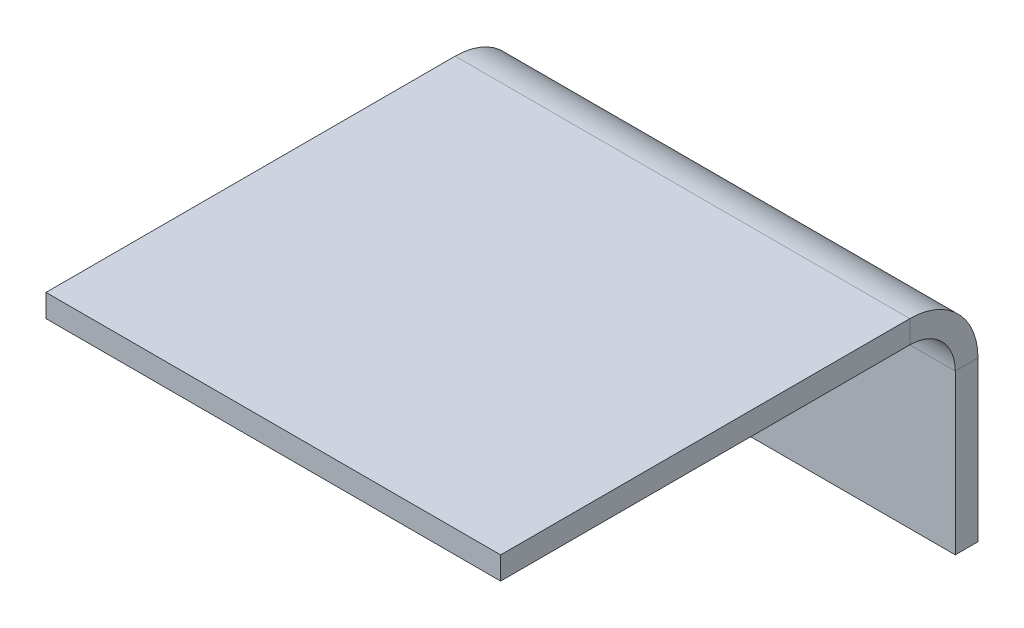
ISO-10303-21;
HEADER;
FILE_DESCRIPTION(('STEP AP214'),'2;1');
FILE_NAME('part.step','',(''),(''),'','','');
FILE_SCHEMA(('AUTOMOTIVE_DESIGN { 1 0 10303 214 1 1 1 1 }'));
ENDSEC;
DATA;
#1=APPLICATION_CONTEXT('core data for automotive mechanical design processes');
#2=APPLICATION_PROTOCOL_DEFINITION('international standard','automotive_design',2000,#1);
#3=PRODUCT_CONTEXT('',#1,'mechanical');
#4=PRODUCT('Part','Part','',(#3));
#5=PRODUCT_RELATED_PRODUCT_CATEGORY('part','',(#4));
#6=PRODUCT_DEFINITION_FORMATION('','',#4);
#7=PRODUCT_DEFINITION_CONTEXT('part definition',#1,'design');
#8=PRODUCT_DEFINITION('design','',#6,#7);
#9=PRODUCT_DEFINITION_SHAPE('','',#8);
#10=(LENGTH_UNIT() NAMED_UNIT(*) SI_UNIT(.MILLI.,.METRE.));
#11=(NAMED_UNIT(*) PLANE_ANGLE_UNIT() SI_UNIT($,.RADIAN.));
#12=(NAMED_UNIT(*) SI_UNIT($,.STERADIAN.) SOLID_ANGLE_UNIT());
#13=UNCERTAINTY_MEASURE_WITH_UNIT(LENGTH_MEASURE(1.E-05),#10,'distance_accuracy_value','');
#14=(GEOMETRIC_REPRESENTATION_CONTEXT(3) GLOBAL_UNCERTAINTY_ASSIGNED_CONTEXT((#13)) GLOBAL_UNIT_ASSIGNED_CONTEXT((#10,
#11,#12)) REPRESENTATION_CONTEXT('',''));
#15=CARTESIAN_POINT('',(0.,0.,0.));
#16=DIRECTION('',(0.,0.,1.));
#17=DIRECTION('',(1.,0.,0.));
#18=AXIS2_PLACEMENT_3D('',#15,#16,#17);
#19=CARTESIAN_POINT('',(0.,0.,-1.));
#20=DIRECTION('',(-1.,0.,0.));
#21=DIRECTION('',(0.,0.,1.));
#22=AXIS2_PLACEMENT_3D('',#19,#20,#21);
#23=PLANE('',#22);
#24=DIRECTION('',(0.,-1.,0.));
#25=VECTOR('',#24,1.);
#26=CARTESIAN_POINT('',(0.,0.,0.));
#27=LINE('',#26,#25);
#28=CARTESIAN_POINT('',(0.,7.00000000000002,0.));
#29=VERTEX_POINT('',#28);
#30=CARTESIAN_POINT('',(0.,0.,0.));
#31=VERTEX_POINT('',#30);
#32=EDGE_CURVE('E119',#29,#31,#27,.T.);
#33=ORIENTED_EDGE('',*,*,#32,.F.);
#34=DIRECTION('',(0.,0.,-1.));
#35=VECTOR('',#34,1.);
#36=CARTESIAN_POINT('',(0.,7.00000000000002,0.));
#37=LINE('',#36,#35);
#38=CARTESIAN_POINT('',(0.,7.00000000000002,-1.));
#39=VERTEX_POINT('',#38);
#40=EDGE_CURVE('E127',#29,#39,#37,.T.);
#41=ORIENTED_EDGE('',*,*,#40,.T.);
#42=DIRECTION('',(0.,-1.,0.));
#43=VECTOR('',#42,1.);
#44=CARTESIAN_POINT('',(0.,0.,-1.));
#45=LINE('',#44,#43);
#46=CARTESIAN_POINT('',(0.,0.,-1.));
#47=VERTEX_POINT('',#46);
#48=EDGE_CURVE('E114',#39,#47,#45,.T.);
#49=ORIENTED_EDGE('',*,*,#48,.T.);
#50=DIRECTION('',(0.,0.,1.));
#51=VECTOR('',#50,1.);
#52=CARTESIAN_POINT('',(0.,0.,-1.));
#53=LINE('',#52,#51);
#54=EDGE_CURVE('E69',#47,#31,#53,.T.);
#55=ORIENTED_EDGE('',*,*,#54,.T.);
#56=EDGE_LOOP('',(#33,#41,#49,#55));
#57=FACE_BOUND('',#56,.T.);
#58=ADVANCED_FACE('F61',(#57),#23,.T.);
#59=CARTESIAN_POINT('',(0.,0.,-1.));
#60=DIRECTION('',(0.,0.,-1.));
#61=DIRECTION('',(-1.,0.,0.));
#62=AXIS2_PLACEMENT_3D('',#59,#60,#61);
#63=PLANE('',#62);
#64=ORIENTED_EDGE('',*,*,#48,.F.);
#65=DIRECTION('',(-1.,0.,0.));
#66=VECTOR('',#65,1.);
#67=CARTESIAN_POINT('',(0.,7.00000000000002,-1.));
#68=LINE('',#67,#66);
#69=CARTESIAN_POINT('',(20.,7.00000000000002,-1.));
#70=VERTEX_POINT('',#69);
#71=EDGE_CURVE('E141',#39,#70,#68,.F.);
#72=ORIENTED_EDGE('',*,*,#71,.T.);
#73=DIRECTION('',(0.,1.,0.));
#74=VECTOR('',#73,1.);
#75=CARTESIAN_POINT('',(20.,0.,-1.));
#76=LINE('',#75,#74);
#77=CARTESIAN_POINT('',(20.,0.,-1.));
#78=VERTEX_POINT('',#77);
#79=EDGE_CURVE('E122',#78,#70,#76,.T.);
#80=ORIENTED_EDGE('',*,*,#79,.F.);
#81=DIRECTION('',(1.,0.,0.));
#82=VECTOR('',#81,1.);
#83=CARTESIAN_POINT('',(0.,0.,-1.));
#84=LINE('',#83,#82);
#85=EDGE_CURVE('E102',#47,#78,#84,.T.);
#86=ORIENTED_EDGE('',*,*,#85,.F.);
#87=EDGE_LOOP('',(#64,#72,#80,#86));
#88=FACE_BOUND('',#87,.T.);
#89=ADVANCED_FACE('F233',(#88),#63,.T.);
#90=CARTESIAN_POINT('',(0.,0.,0.));
#91=DIRECTION('',(0.,0.,-1.));
#92=DIRECTION('',(-1.,0.,0.));
#93=AXIS2_PLACEMENT_3D('',#90,#91,#92);
#94=PLANE('',#93);
#95=DIRECTION('',(-1.,0.,0.));
#96=VECTOR('',#95,1.);
#97=CARTESIAN_POINT('',(0.,7.00000000000002,0.));
#98=LINE('',#97,#96);
#99=CARTESIAN_POINT('',(20.,7.00000000000002,0.));
#100=VERTEX_POINT('',#99);
#101=EDGE_CURVE('E132',#29,#100,#98,.F.);
#102=ORIENTED_EDGE('',*,*,#101,.F.);
#103=ORIENTED_EDGE('',*,*,#32,.T.);
#104=DIRECTION('',(1.,0.,0.));
#105=VECTOR('',#104,1.);
#106=CARTESIAN_POINT('',(0.,0.,0.));
#107=LINE('',#106,#105);
#108=CARTESIAN_POINT('',(20.,0.,0.));
#109=VERTEX_POINT('',#108);
#110=EDGE_CURVE('E105',#31,#109,#107,.T.);
#111=ORIENTED_EDGE('',*,*,#110,.T.);
#112=DIRECTION('',(0.,1.,0.));
#113=VECTOR('',#112,1.);
#114=CARTESIAN_POINT('',(20.,0.,0.));
#115=LINE('',#114,#113);
#116=EDGE_CURVE('E110',#109,#100,#115,.T.);
#117=ORIENTED_EDGE('',*,*,#116,.T.);
#118=EDGE_LOOP('',(#102,#103,#111,#117));
#119=FACE_BOUND('',#118,.T.);
#120=ADVANCED_FACE('F113',(#119),#94,.F.);
#121=CARTESIAN_POINT('',(20.,0.,-1.));
#122=DIRECTION('',(1.,0.,0.));
#123=DIRECTION('',(0.,0.,-1.));
#124=AXIS2_PLACEMENT_3D('',#121,#122,#123);
#125=PLANE('',#124);
#126=DIRECTION('',(0.,0.,-1.));
#127=VECTOR('',#126,1.);
#128=CARTESIAN_POINT('',(20.,7.00000000000002,0.));
#129=LINE('',#128,#127);
#130=EDGE_CURVE('E109',#100,#70,#129,.T.);
#131=ORIENTED_EDGE('',*,*,#130,.F.);
#132=ORIENTED_EDGE('',*,*,#116,.F.);
#133=DIRECTION('',(0.,0.,1.));
#134=VECTOR('',#133,1.);
#135=CARTESIAN_POINT('',(20.,0.,-1.));
#136=LINE('',#135,#134);
#137=EDGE_CURVE('E13',#78,#109,#136,.T.);
#138=ORIENTED_EDGE('',*,*,#137,.F.);
#139=ORIENTED_EDGE('',*,*,#79,.T.);
#140=EDGE_LOOP('',(#131,#132,#138,#139));
#141=FACE_BOUND('',#140,.T.);
#142=ADVANCED_FACE('F107',(#141),#125,.T.);
#143=CARTESIAN_POINT('',(0.,0.,-1.));
#144=DIRECTION('',(0.,-1.,0.));
#145=DIRECTION('',(0.,0.,-1.));
#146=AXIS2_PLACEMENT_3D('',#143,#144,#145);
#147=PLANE('',#146);
#148=ORIENTED_EDGE('',*,*,#110,.F.);
#149=ORIENTED_EDGE('',*,*,#54,.F.);
#150=ORIENTED_EDGE('',*,*,#85,.T.);
#151=ORIENTED_EDGE('',*,*,#137,.T.);
#152=EDGE_LOOP('',(#148,#149,#150,#151));
#153=FACE_BOUND('',#152,.T.);
#154=ADVANCED_FACE('F97',(#153),#147,.T.);
#155=CARTESIAN_POINT('',(20.,7.00000000000002,2.));
#156=DIRECTION('',(1.,0.,0.));
#157=DIRECTION('',(0.,0.,-1.));
#158=AXIS2_PLACEMENT_3D('',#155,#156,#157);
#159=PLANE('',#158);
#160=DIRECTION('',(0.,-1.,0.));
#161=VECTOR('',#160,1.);
#162=CARTESIAN_POINT('',(20.,10.,1.99999999999998));
#163=LINE('',#162,#161);
#164=CARTESIAN_POINT('',(20.,9.00000000000001,1.99999999999999));
#165=VERTEX_POINT('',#164);
#166=CARTESIAN_POINT('',(20.,10.,1.99999999999998));
#167=VERTEX_POINT('',#166);
#168=EDGE_CURVE('E150',#165,#167,#163,.F.);
#169=ORIENTED_EDGE('',*,*,#168,.F.);
#170=CARTESIAN_POINT('',(20.,7.00000000000002,2.));
#171=DIRECTION('',(-1.,0.,0.));
#172=DIRECTION('',(0.,0.,1.));
#173=AXIS2_PLACEMENT_3D('',#170,#171,#172);
#174=CIRCLE('',#173,2.);
#175=EDGE_CURVE('E137',#100,#165,#174,.F.);
#176=ORIENTED_EDGE('',*,*,#175,.F.);
#177=ORIENTED_EDGE('',*,*,#130,.T.);
#178=CARTESIAN_POINT('',(20.,7.00000000000002,2.));
#179=DIRECTION('',(-1.,0.,0.));
#180=DIRECTION('',(0.,0.,1.));
#181=AXIS2_PLACEMENT_3D('',#178,#179,#180);
#182=CIRCLE('',#181,3.);
#183=EDGE_CURVE('E80',#70,#167,#182,.F.);
#184=ORIENTED_EDGE('',*,*,#183,.T.);
#185=EDGE_LOOP('',(#169,#176,#177,#184));
#186=FACE_BOUND('',#185,.T.);
#187=ADVANCED_FACE('F231',(#186),#159,.T.);
#188=CARTESIAN_POINT('',(0.,7.00000000000002,2.));
#189=DIRECTION('',(1.,0.,0.));
#190=DIRECTION('',(0.,0.,-1.));
#191=AXIS2_PLACEMENT_3D('',#188,#189,#190);
#192=PLANE('',#191);
#193=CARTESIAN_POINT('',(0.,7.00000000000002,2.));
#194=DIRECTION('',(-1.,0.,0.));
#195=DIRECTION('',(0.,0.,1.));
#196=AXIS2_PLACEMENT_3D('',#193,#194,#195);
#197=CIRCLE('',#196,2.);
#198=CARTESIAN_POINT('',(0.,9.00000000000001,1.99999999999999));
#199=VERTEX_POINT('',#198);
#200=EDGE_CURVE('E128',#199,#29,#197,.T.);
#201=ORIENTED_EDGE('',*,*,#200,.F.);
#202=DIRECTION('',(0.,-1.,0.));
#203=VECTOR('',#202,1.);
#204=CARTESIAN_POINT('',(0.,9.00000000000001,1.99999999999999));
#205=LINE('',#204,#203);
#206=CARTESIAN_POINT('',(0.,10.,1.99999999999998));
#207=VERTEX_POINT('',#206);
#208=EDGE_CURVE('E153',#199,#207,#205,.F.);
#209=ORIENTED_EDGE('',*,*,#208,.T.);
#210=CARTESIAN_POINT('',(0.,7.00000000000002,2.));
#211=DIRECTION('',(-1.,0.,0.));
#212=DIRECTION('',(0.,0.,1.));
#213=AXIS2_PLACEMENT_3D('',#210,#211,#212);
#214=CIRCLE('',#213,3.);
#215=EDGE_CURVE('E140',#207,#39,#214,.T.);
#216=ORIENTED_EDGE('',*,*,#215,.T.);
#217=ORIENTED_EDGE('',*,*,#40,.F.);
#218=EDGE_LOOP('',(#201,#209,#216,#217));
#219=FACE_BOUND('',#218,.T.);
#220=ADVANCED_FACE('F224',(#219),#192,.F.);
#221=CARTESIAN_POINT('',(0.,7.00000000000002,2.));
#222=DIRECTION('',(-1.,0.,0.));
#223=DIRECTION('',(0.,1.,0.));
#224=AXIS2_PLACEMENT_3D('',#221,#222,#223);
#225=CYLINDRICAL_SURFACE('',#224,3.);
#226=ORIENTED_EDGE('',*,*,#71,.F.);
#227=ORIENTED_EDGE('',*,*,#215,.F.);
#228=DIRECTION('',(-1.,0.,0.));
#229=VECTOR('',#228,1.);
#230=CARTESIAN_POINT('',(20.,10.,1.99999999999998));
#231=LINE('',#230,#229);
#232=EDGE_CURVE('E156',#207,#167,#231,.F.);
#233=ORIENTED_EDGE('',*,*,#232,.T.);
#234=ORIENTED_EDGE('',*,*,#183,.F.);
#235=EDGE_LOOP('',(#226,#227,#233,#234));
#236=FACE_BOUND('',#235,.T.);
#237=ADVANCED_FACE('F230',(#236),#225,.T.);
#238=CARTESIAN_POINT('',(0.,7.00000000000002,2.));
#239=DIRECTION('',(-1.,0.,0.));
#240=DIRECTION('',(0.,1.,0.));
#241=AXIS2_PLACEMENT_3D('',#238,#239,#240);
#242=CYLINDRICAL_SURFACE('',#241,2.);
#243=ORIENTED_EDGE('',*,*,#101,.T.);
#244=ORIENTED_EDGE('',*,*,#175,.T.);
#245=DIRECTION('',(-1.,0.,0.));
#246=VECTOR('',#245,1.);
#247=CARTESIAN_POINT('',(20.,9.00000000000001,1.99999999999999));
#248=LINE('',#247,#246);
#249=EDGE_CURVE('E147',#165,#199,#248,.T.);
#250=ORIENTED_EDGE('',*,*,#249,.T.);
#251=ORIENTED_EDGE('',*,*,#200,.T.);
#252=EDGE_LOOP('',(#243,#244,#250,#251));
#253=FACE_BOUND('',#252,.T.);
#254=ADVANCED_FACE('F217',(#253),#242,.F.);
#255=CARTESIAN_POINT('',(20.,10.,0.));
#256=DIRECTION('',(-1.,0.,0.));
#257=DIRECTION('',(0.,0.,1.));
#258=AXIS2_PLACEMENT_3D('',#255,#256,#257);
#259=PLANE('',#258);
#260=ORIENTED_EDGE('',*,*,#168,.T.);
#261=DIRECTION('',(0.,0.,-1.));
#262=VECTOR('',#261,1.);
#263=CARTESIAN_POINT('',(20.,10.,0.));
#264=LINE('',#263,#262);
#265=CARTESIAN_POINT('',(20.,10.0000000000001,20.));
#266=VERTEX_POINT('',#265);
#267=EDGE_CURVE('E170',#266,#167,#264,.T.);
#268=ORIENTED_EDGE('',*,*,#267,.F.);
#269=DIRECTION('',(0.,-1.,0.));
#270=VECTOR('',#269,1.);
#271=CARTESIAN_POINT('',(20.,10.0000000000001,20.));
#272=LINE('',#271,#270);
#273=CARTESIAN_POINT('',(20.,9.00000000000014,20.));
#274=VERTEX_POINT('',#273);
#275=EDGE_CURVE('E176',#266,#274,#272,.T.);
#276=ORIENTED_EDGE('',*,*,#275,.T.);
#277=DIRECTION('',(0.,0.,1.));
#278=VECTOR('',#277,1.);
#279=CARTESIAN_POINT('',(20.,9.,0.));
#280=LINE('',#279,#278);
#281=EDGE_CURVE('E158',#274,#165,#280,.F.);
#282=ORIENTED_EDGE('',*,*,#281,.T.);
#283=EDGE_LOOP('',(#260,#268,#276,#282));
#284=FACE_BOUND('',#283,.T.);
#285=ADVANCED_FACE('F228',(#284),#259,.F.);
#286=CARTESIAN_POINT('',(0.,10.,0.));
#287=DIRECTION('',(1.,0.,0.));
#288=DIRECTION('',(0.,0.,-1.));
#289=AXIS2_PLACEMENT_3D('',#286,#287,#288);
#290=PLANE('',#289);
#291=ORIENTED_EDGE('',*,*,#208,.F.);
#292=DIRECTION('',(0.,0.,-1.));
#293=VECTOR('',#292,1.);
#294=CARTESIAN_POINT('',(0.,9.,0.));
#295=LINE('',#294,#293);
#296=CARTESIAN_POINT('',(0.,9.00000000000014,20.));
#297=VERTEX_POINT('',#296);
#298=EDGE_CURVE('E161',#199,#297,#295,.F.);
#299=ORIENTED_EDGE('',*,*,#298,.T.);
#300=DIRECTION('',(0.,-1.,0.));
#301=VECTOR('',#300,1.);
#302=CARTESIAN_POINT('',(0.,10.0000000000001,20.));
#303=LINE('',#302,#301);
#304=CARTESIAN_POINT('',(0.,10.0000000000001,20.));
#305=VERTEX_POINT('',#304);
#306=EDGE_CURVE('E135',#305,#297,#303,.T.);
#307=ORIENTED_EDGE('',*,*,#306,.F.);
#308=DIRECTION('',(0.,0.,1.));
#309=VECTOR('',#308,1.);
#310=CARTESIAN_POINT('',(0.,10.,0.));
#311=LINE('',#310,#309);
#312=EDGE_CURVE('E168',#207,#305,#311,.T.);
#313=ORIENTED_EDGE('',*,*,#312,.F.);
#314=EDGE_LOOP('',(#291,#299,#307,#313));
#315=FACE_BOUND('',#314,.T.);
#316=ADVANCED_FACE('F193',(#315),#290,.F.);
#317=CARTESIAN_POINT('',(0.,10.,0.));
#318=DIRECTION('',(0.,-1.,0.));
#319=DIRECTION('',(0.,0.,-1.));
#320=AXIS2_PLACEMENT_3D('',#317,#318,#319);
#321=PLANE('',#320);
#322=ORIENTED_EDGE('',*,*,#232,.F.);
#323=ORIENTED_EDGE('',*,*,#312,.T.);
#324=DIRECTION('',(1.,0.,0.));
#325=VECTOR('',#324,1.);
#326=CARTESIAN_POINT('',(0.,10.0000000000001,20.));
#327=LINE('',#326,#325);
#328=EDGE_CURVE('E172',#305,#266,#327,.T.);
#329=ORIENTED_EDGE('',*,*,#328,.T.);
#330=ORIENTED_EDGE('',*,*,#267,.T.);
#331=EDGE_LOOP('',(#322,#323,#329,#330));
#332=FACE_BOUND('',#331,.T.);
#333=ADVANCED_FACE('F227',(#332),#321,.F.);
#334=CARTESIAN_POINT('',(0.,9.,0.));
#335=DIRECTION('',(0.,-1.,0.));
#336=DIRECTION('',(0.,0.,-1.));
#337=AXIS2_PLACEMENT_3D('',#334,#335,#336);
#338=PLANE('',#337);
#339=ORIENTED_EDGE('',*,*,#298,.F.);
#340=ORIENTED_EDGE('',*,*,#249,.F.);
#341=ORIENTED_EDGE('',*,*,#281,.F.);
#342=DIRECTION('',(-1.,0.,0.));
#343=VECTOR('',#342,1.);
#344=CARTESIAN_POINT('',(20.,9.00000000000014,20.));
#345=LINE('',#344,#343);
#346=EDGE_CURVE('E163',#297,#274,#345,.F.);
#347=ORIENTED_EDGE('',*,*,#346,.F.);
#348=EDGE_LOOP('',(#339,#340,#341,#347));
#349=FACE_BOUND('',#348,.T.);
#350=ADVANCED_FACE('F221',(#349),#338,.T.);
#351=CARTESIAN_POINT('',(20.,10.0000000000001,20.));
#352=DIRECTION('',(0.,0.,-1.));
#353=DIRECTION('',(0.,1.,0.));
#354=AXIS2_PLACEMENT_3D('',#351,#352,#353);
#355=PLANE('',#354);
#356=ORIENTED_EDGE('',*,*,#346,.T.);
#357=ORIENTED_EDGE('',*,*,#275,.F.);
#358=ORIENTED_EDGE('',*,*,#328,.F.);
#359=ORIENTED_EDGE('',*,*,#306,.T.);
#360=EDGE_LOOP('',(#356,#357,#358,#359));
#361=FACE_BOUND('',#360,.T.);
#362=ADVANCED_FACE('F184',(#361),#355,.F.);
#363=CLOSED_SHELL('',(#58,#89,#120,#142,#154,#187,#220,#237,#254,#285,#316,#333,#350,#362));
#364=MANIFOLD_SOLID_BREP('B2',#363);
#365=ADVANCED_BREP_SHAPE_REPRESENTATION('',(#18,#364),#14);
#366=SHAPE_DEFINITION_REPRESENTATION(#9,#365);
ENDSEC;
END-ISO-10303-21;
